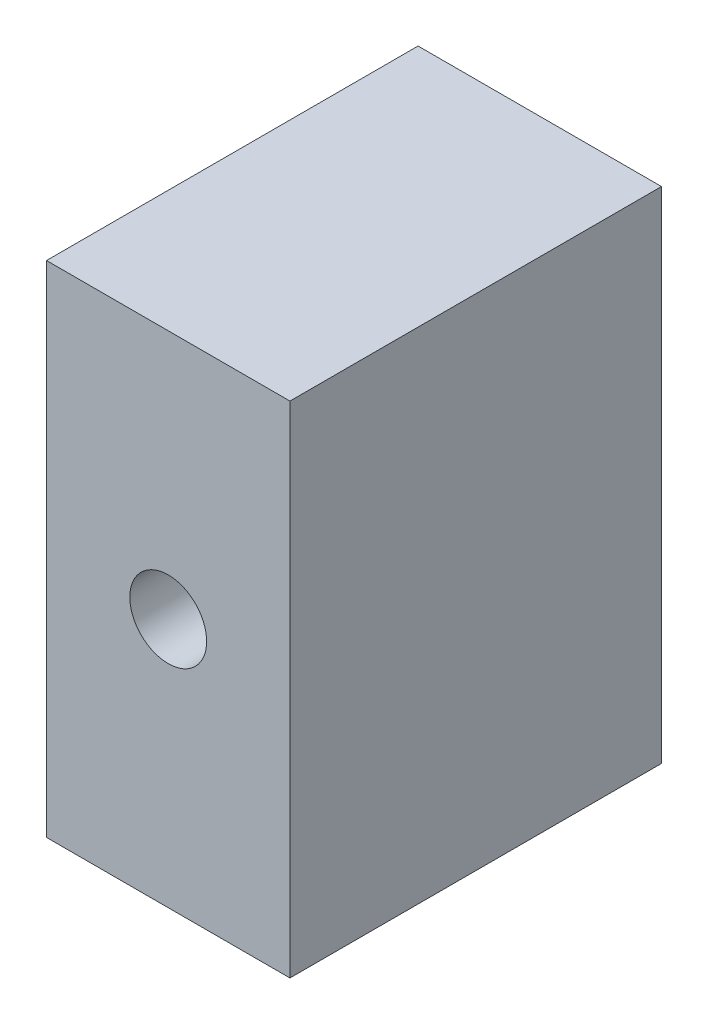
ISO-10303-21;
HEADER;
FILE_DESCRIPTION(('STEP AP214'),'2;1');
FILE_NAME('part.step','',(''),(''),'','','');
FILE_SCHEMA(('AUTOMOTIVE_DESIGN { 1 0 10303 214 1 1 1 1 }'));
ENDSEC;
DATA;
#1=APPLICATION_CONTEXT('core data for automotive mechanical design processes');
#2=APPLICATION_PROTOCOL_DEFINITION('international standard','automotive_design',2000,#1);
#3=PRODUCT_CONTEXT('',#1,'mechanical');
#4=PRODUCT('Part','Part','',(#3));
#5=PRODUCT_RELATED_PRODUCT_CATEGORY('part','',(#4));
#6=PRODUCT_DEFINITION_FORMATION('','',#4);
#7=PRODUCT_DEFINITION_CONTEXT('part definition',#1,'design');
#8=PRODUCT_DEFINITION('design','',#6,#7);
#9=PRODUCT_DEFINITION_SHAPE('','',#8);
#10=(LENGTH_UNIT() NAMED_UNIT(*) SI_UNIT(.MILLI.,.METRE.));
#11=(NAMED_UNIT(*) PLANE_ANGLE_UNIT() SI_UNIT($,.RADIAN.));
#12=(NAMED_UNIT(*) SI_UNIT($,.STERADIAN.) SOLID_ANGLE_UNIT());
#13=UNCERTAINTY_MEASURE_WITH_UNIT(LENGTH_MEASURE(1.E-05),#10,'distance_accuracy_value','');
#14=(GEOMETRIC_REPRESENTATION_CONTEXT(3) GLOBAL_UNCERTAINTY_ASSIGNED_CONTEXT((#13)) GLOBAL_UNIT_ASSIGNED_CONTEXT((#10,
#11,#12)) REPRESENTATION_CONTEXT('',''));
#15=CARTESIAN_POINT('',(0.,0.,0.));
#16=DIRECTION('',(0.,0.,1.));
#17=DIRECTION('',(1.,0.,0.));
#18=AXIS2_PLACEMENT_3D('',#15,#16,#17);
#19=CARTESIAN_POINT('',(0.,0.,29.));
#20=DIRECTION('',(0.,0.,-1.));
#21=DIRECTION('',(-1.,0.,0.));
#22=AXIS2_PLACEMENT_3D('',#19,#20,#21);
#23=PLANE('',#22);
#24=DIRECTION('',(0.,-1.,0.));
#25=VECTOR('',#24,1.);
#26=CARTESIAN_POINT('',(0.,0.,29.));
#27=LINE('',#26,#25);
#28=CARTESIAN_POINT('',(0.,39.,29.));
#29=VERTEX_POINT('',#28);
#30=CARTESIAN_POINT('',(0.,0.,29.));
#31=VERTEX_POINT('',#30);
#32=EDGE_CURVE('E91',#29,#31,#27,.T.);
#33=ORIENTED_EDGE('',*,*,#32,.T.);
#34=DIRECTION('',(1.,0.,0.));
#35=VECTOR('',#34,1.);
#36=CARTESIAN_POINT('',(0.,0.,29.));
#37=LINE('',#36,#35);
#38=CARTESIAN_POINT('',(19.,0.,29.));
#39=VERTEX_POINT('',#38);
#40=EDGE_CURVE('E86',#31,#39,#37,.T.);
#41=ORIENTED_EDGE('',*,*,#40,.T.);
#42=DIRECTION('',(0.,1.,0.));
#43=VECTOR('',#42,1.);
#44=CARTESIAN_POINT('',(19.,0.,29.));
#45=LINE('',#44,#43);
#46=CARTESIAN_POINT('',(19.,39.,29.));
#47=VERTEX_POINT('',#46);
#48=EDGE_CURVE('E89',#39,#47,#45,.T.);
#49=ORIENTED_EDGE('',*,*,#48,.T.);
#50=DIRECTION('',(-1.,0.,0.));
#51=VECTOR('',#50,1.);
#52=CARTESIAN_POINT('',(0.,39.,29.));
#53=LINE('',#52,#51);
#54=EDGE_CURVE('E56',#47,#29,#53,.T.);
#55=ORIENTED_EDGE('',*,*,#54,.T.);
#56=EDGE_LOOP('',(#33,#41,#49,#55));
#57=FACE_BOUND('',#56,.T.);
#58=CARTESIAN_POINT('',(9.5,19.5,29.));
#59=DIRECTION('',(0.,0.,1.));
#60=DIRECTION('',(1.,0.,0.));
#61=AXIS2_PLACEMENT_3D('',#58,#59,#60);
#62=CIRCLE('',#61,3.);
#63=CARTESIAN_POINT('',(6.5,19.5,29.));
#64=VERTEX_POINT('',#63);
#65=EDGE_CURVE('E106',#64,#64,#62,.T.);
#66=ORIENTED_EDGE('',*,*,#65,.F.);
#67=EDGE_LOOP('',(#66));
#68=FACE_BOUND('',#67,.T.);
#69=ADVANCED_FACE('F39',(#57,#68),#23,.F.);
#70=CARTESIAN_POINT('',(0.,0.,0.));
#71=DIRECTION('',(0.,0.,-1.));
#72=DIRECTION('',(-1.,0.,0.));
#73=AXIS2_PLACEMENT_3D('',#70,#71,#72);
#74=PLANE('',#73);
#75=DIRECTION('',(0.,-1.,0.));
#76=VECTOR('',#75,1.);
#77=CARTESIAN_POINT('',(0.,0.,0.));
#78=LINE('',#77,#76);
#79=CARTESIAN_POINT('',(0.,39.,0.));
#80=VERTEX_POINT('',#79);
#81=CARTESIAN_POINT('',(0.,0.,0.));
#82=VERTEX_POINT('',#81);
#83=EDGE_CURVE('E103',#80,#82,#78,.T.);
#84=ORIENTED_EDGE('',*,*,#83,.F.);
#85=DIRECTION('',(-1.,0.,0.));
#86=VECTOR('',#85,1.);
#87=CARTESIAN_POINT('',(0.,39.,0.));
#88=LINE('',#87,#86);
#89=CARTESIAN_POINT('',(19.,39.,0.));
#90=VERTEX_POINT('',#89);
#91=EDGE_CURVE('E79',#90,#80,#88,.T.);
#92=ORIENTED_EDGE('',*,*,#91,.F.);
#93=DIRECTION('',(0.,1.,0.));
#94=VECTOR('',#93,1.);
#95=CARTESIAN_POINT('',(19.,0.,0.));
#96=LINE('',#95,#94);
#97=CARTESIAN_POINT('',(19.,0.,0.));
#98=VERTEX_POINT('',#97);
#99=EDGE_CURVE('E73',#98,#90,#96,.T.);
#100=ORIENTED_EDGE('',*,*,#99,.F.);
#101=DIRECTION('',(1.,0.,0.));
#102=VECTOR('',#101,1.);
#103=CARTESIAN_POINT('',(0.,0.,0.));
#104=LINE('',#103,#102);
#105=EDGE_CURVE('E95',#82,#98,#104,.T.);
#106=ORIENTED_EDGE('',*,*,#105,.F.);
#107=EDGE_LOOP('',(#84,#92,#100,#106));
#108=FACE_BOUND('',#107,.T.);
#109=CARTESIAN_POINT('',(9.5,19.5,0.));
#110=DIRECTION('',(0.,0.,1.));
#111=DIRECTION('',(1.,0.,0.));
#112=AXIS2_PLACEMENT_3D('',#109,#110,#111);
#113=CIRCLE('',#112,3.);
#114=CARTESIAN_POINT('',(6.5,19.5,0.));
#115=VERTEX_POINT('',#114);
#116=EDGE_CURVE('E118',#115,#115,#113,.T.);
#117=ORIENTED_EDGE('',*,*,#116,.T.);
#118=EDGE_LOOP('',(#117));
#119=FACE_BOUND('',#118,.T.);
#120=ADVANCED_FACE('F114',(#108,#119),#74,.T.);
#121=CARTESIAN_POINT('',(0.,0.,29.));
#122=DIRECTION('',(1.,0.,0.));
#123=DIRECTION('',(0.,0.,-1.));
#124=AXIS2_PLACEMENT_3D('',#121,#122,#123);
#125=PLANE('',#124);
#126=ORIENTED_EDGE('',*,*,#83,.T.);
#127=DIRECTION('',(0.,0.,-1.));
#128=VECTOR('',#127,1.);
#129=CARTESIAN_POINT('',(0.,0.,29.));
#130=LINE('',#129,#128);
#131=EDGE_CURVE('E11',#31,#82,#130,.T.);
#132=ORIENTED_EDGE('',*,*,#131,.F.);
#133=ORIENTED_EDGE('',*,*,#32,.F.);
#134=DIRECTION('',(0.,0.,-1.));
#135=VECTOR('',#134,1.);
#136=CARTESIAN_POINT('',(0.,39.,29.));
#137=LINE('',#136,#135);
#138=EDGE_CURVE('E99',#29,#80,#137,.T.);
#139=ORIENTED_EDGE('',*,*,#138,.T.);
#140=EDGE_LOOP('',(#126,#132,#133,#139));
#141=FACE_BOUND('',#140,.T.);
#142=ADVANCED_FACE('F41',(#141),#125,.F.);
#143=CARTESIAN_POINT('',(0.,0.,29.));
#144=DIRECTION('',(0.,1.,0.));
#145=DIRECTION('',(0.,0.,1.));
#146=AXIS2_PLACEMENT_3D('',#143,#144,#145);
#147=PLANE('',#146);
#148=ORIENTED_EDGE('',*,*,#105,.T.);
#149=DIRECTION('',(0.,0.,-1.));
#150=VECTOR('',#149,1.);
#151=CARTESIAN_POINT('',(19.,0.,29.));
#152=LINE('',#151,#150);
#153=EDGE_CURVE('E48',#39,#98,#152,.T.);
#154=ORIENTED_EDGE('',*,*,#153,.F.);
#155=ORIENTED_EDGE('',*,*,#40,.F.);
#156=ORIENTED_EDGE('',*,*,#131,.T.);
#157=EDGE_LOOP('',(#148,#154,#155,#156));
#158=FACE_BOUND('',#157,.T.);
#159=ADVANCED_FACE('F94',(#158),#147,.F.);
#160=CARTESIAN_POINT('',(19.,0.,29.));
#161=DIRECTION('',(-1.,0.,0.));
#162=DIRECTION('',(0.,0.,1.));
#163=AXIS2_PLACEMENT_3D('',#160,#161,#162);
#164=PLANE('',#163);
#165=ORIENTED_EDGE('',*,*,#99,.T.);
#166=DIRECTION('',(0.,0.,-1.));
#167=VECTOR('',#166,1.);
#168=CARTESIAN_POINT('',(19.,39.,29.));
#169=LINE('',#168,#167);
#170=EDGE_CURVE('E96',#47,#90,#169,.T.);
#171=ORIENTED_EDGE('',*,*,#170,.F.);
#172=ORIENTED_EDGE('',*,*,#48,.F.);
#173=ORIENTED_EDGE('',*,*,#153,.T.);
#174=EDGE_LOOP('',(#165,#171,#172,#173));
#175=FACE_BOUND('',#174,.T.);
#176=ADVANCED_FACE('F97',(#175),#164,.F.);
#177=CARTESIAN_POINT('',(0.,39.,29.));
#178=DIRECTION('',(0.,-1.,0.));
#179=DIRECTION('',(0.,0.,-1.));
#180=AXIS2_PLACEMENT_3D('',#177,#178,#179);
#181=PLANE('',#180);
#182=ORIENTED_EDGE('',*,*,#91,.T.);
#183=ORIENTED_EDGE('',*,*,#138,.F.);
#184=ORIENTED_EDGE('',*,*,#54,.F.);
#185=ORIENTED_EDGE('',*,*,#170,.T.);
#186=EDGE_LOOP('',(#182,#183,#184,#185));
#187=FACE_BOUND('',#186,.T.);
#188=ADVANCED_FACE('F111',(#187),#181,.F.);
#189=CARTESIAN_POINT('',(9.5,19.5,29.));
#190=DIRECTION('',(0.,0.,-1.));
#191=DIRECTION('',(-1.,0.,0.));
#192=AXIS2_PLACEMENT_3D('',#189,#190,#191);
#193=CYLINDRICAL_SURFACE('',#192,3.);
#194=CARTESIAN_POINT('',(6.5,19.5,29.));
#195=CARTESIAN_POINT('',(6.5,19.5,28.6979166666667));
#196=CARTESIAN_POINT('',(6.5,19.5,28.3958333333333));
#197=CARTESIAN_POINT('',(6.5,19.5,27.7916666666667));
#198=CARTESIAN_POINT('',(6.5,19.5,27.4895833333333));
#199=CARTESIAN_POINT('',(6.5,19.5,26.8854166666667));
#200=CARTESIAN_POINT('',(6.5,19.5,26.5833333333333));
#201=CARTESIAN_POINT('',(6.5,19.5,25.9791666666667));
#202=CARTESIAN_POINT('',(6.5,19.5,25.6770833333333));
#203=CARTESIAN_POINT('',(6.5,19.5,25.0729166666667));
#204=CARTESIAN_POINT('',(6.5,19.5,24.7708333333333));
#205=CARTESIAN_POINT('',(6.5,19.5,24.1666666666667));
#206=CARTESIAN_POINT('',(6.5,19.5,23.8645833333333));
#207=CARTESIAN_POINT('',(6.5,19.5,23.2604166666667));
#208=CARTESIAN_POINT('',(6.5,19.5,22.9583333333333));
#209=CARTESIAN_POINT('',(6.5,19.5,22.3541666666667));
#210=CARTESIAN_POINT('',(6.5,19.5,22.0520833333333));
#211=CARTESIAN_POINT('',(6.5,19.5,21.4479166666667));
#212=CARTESIAN_POINT('',(6.5,19.5,21.1458333333333));
#213=CARTESIAN_POINT('',(6.5,19.5,20.5416666666667));
#214=CARTESIAN_POINT('',(6.5,19.5,20.2395833333333));
#215=CARTESIAN_POINT('',(6.5,19.5,19.6354166666667));
#216=CARTESIAN_POINT('',(6.5,19.5,19.3333333333333));
#217=CARTESIAN_POINT('',(6.5,19.5,18.7291666666667));
#218=CARTESIAN_POINT('',(6.5,19.5,18.4270833333333));
#219=CARTESIAN_POINT('',(6.5,19.5,17.8229166666667));
#220=CARTESIAN_POINT('',(6.5,19.5,17.5208333333333));
#221=CARTESIAN_POINT('',(6.5,19.5,16.9166666666667));
#222=CARTESIAN_POINT('',(6.5,19.5,16.6145833333333));
#223=CARTESIAN_POINT('',(6.5,19.5,16.0104166666667));
#224=CARTESIAN_POINT('',(6.5,19.5,15.7083333333333));
#225=CARTESIAN_POINT('',(6.5,19.5,15.1041666666667));
#226=CARTESIAN_POINT('',(6.5,19.5,14.8020833333333));
#227=CARTESIAN_POINT('',(6.5,19.5,14.1979166666667));
#228=CARTESIAN_POINT('',(6.5,19.5,13.8958333333333));
#229=CARTESIAN_POINT('',(6.5,19.5,13.2916666666667));
#230=CARTESIAN_POINT('',(6.5,19.5,12.9895833333333));
#231=CARTESIAN_POINT('',(6.5,19.5,12.3854166666667));
#232=CARTESIAN_POINT('',(6.5,19.5,12.0833333333333));
#233=CARTESIAN_POINT('',(6.5,19.5,11.4791666666667));
#234=CARTESIAN_POINT('',(6.5,19.5,11.1770833333333));
#235=CARTESIAN_POINT('',(6.5,19.5,10.5729166666667));
#236=CARTESIAN_POINT('',(6.5,19.5,10.2708333333333));
#237=CARTESIAN_POINT('',(6.5,19.5,9.66666666666667));
#238=CARTESIAN_POINT('',(6.5,19.5,9.36458333333333));
#239=CARTESIAN_POINT('',(6.5,19.5,8.76041666666667));
#240=CARTESIAN_POINT('',(6.5,19.5,8.45833333333333));
#241=CARTESIAN_POINT('',(6.5,19.5,7.85416666666667));
#242=CARTESIAN_POINT('',(6.5,19.5,7.55208333333333));
#243=CARTESIAN_POINT('',(6.5,19.5,6.94791666666667));
#244=CARTESIAN_POINT('',(6.5,19.5,6.64583333333333));
#245=CARTESIAN_POINT('',(6.5,19.5,6.04166666666667));
#246=CARTESIAN_POINT('',(6.5,19.5,5.73958333333333));
#247=CARTESIAN_POINT('',(6.5,19.5,5.13541666666667));
#248=CARTESIAN_POINT('',(6.5,19.5,4.83333333333333));
#249=CARTESIAN_POINT('',(6.5,19.5,4.22916666666667));
#250=CARTESIAN_POINT('',(6.5,19.5,3.92708333333333));
#251=CARTESIAN_POINT('',(6.5,19.5,3.32291666666667));
#252=CARTESIAN_POINT('',(6.5,19.5,3.02083333333333));
#253=CARTESIAN_POINT('',(6.5,19.5,2.41666666666667));
#254=CARTESIAN_POINT('',(6.5,19.5,2.11458333333333));
#255=CARTESIAN_POINT('',(6.5,19.5,1.51041666666667));
#256=CARTESIAN_POINT('',(6.5,19.5,1.20833333333333));
#257=CARTESIAN_POINT('',(6.5,19.5,0.604166666666667));
#258=CARTESIAN_POINT('',(6.5,19.5,0.302083333333333));
#259=CARTESIAN_POINT('',(6.5,19.5,0.));
#260=B_SPLINE_CURVE_WITH_KNOTS('',3,(#194,#195,#196,#197,#198,#199,#200,#201,#202,#203,#204,
#205,#206,#207,#208,#209,#210,#211,#212,#213,#214,#215,#216,#217,#218,#219,#220,#221,#222,#223,
#224,#225,#226,#227,#228,#229,#230,#231,#232,#233,#234,#235,#236,#237,#238,#239,#240,#241,#242,
#243,#244,#245,#246,#247,#248,#249,#250,#251,#252,#253,#254,#255,#256,#257,#258,#259),
.UNSPECIFIED.,.F.,.F.,(4,2,2,2,2,2,2,2,2,2,2,2,2,2,2,2,2,2,2,2,2,2,2,2,2,2,2,2,2,2,2,2,4),(0.,
0.906249999999997,1.8125,2.71875,3.625,4.53125,5.4375,6.34375,7.25,8.15625,9.0625,9.96875,
10.875,11.78125,12.6875,13.59375,14.5,15.40625,16.3125,17.21875,18.125,19.03125,19.9375,
20.84375,21.75,22.65625,23.5625,24.46875,25.375,26.28125,27.1875,28.09375,29.),.UNSPECIFIED.);
#261=EDGE_CURVE('BSEAM124',#64,#115,#260,.T.);
#262=ORIENTED_EDGE('',*,*,#65,.T.);
#263=ORIENTED_EDGE('',*,*,#116,.F.);
#264=ORIENTED_EDGE('',*,*,#261,.T.);
#265=ORIENTED_EDGE('',*,*,#261,.F.);
#266=EDGE_LOOP('',(#262,#264,#263,#265));
#267=FACE_BOUND('',#266,.T.);
#268=ADVANCED_FACE('F124',(#267),#193,.F.);
#269=CLOSED_SHELL('',(#69,#120,#142,#159,#176,#188,#268));
#270=MANIFOLD_SOLID_BREP('B2',#269);
#271=ADVANCED_BREP_SHAPE_REPRESENTATION('',(#18,#270),#14);
#272=SHAPE_DEFINITION_REPRESENTATION(#9,#271);
ENDSEC;
END-ISO-10303-21;
